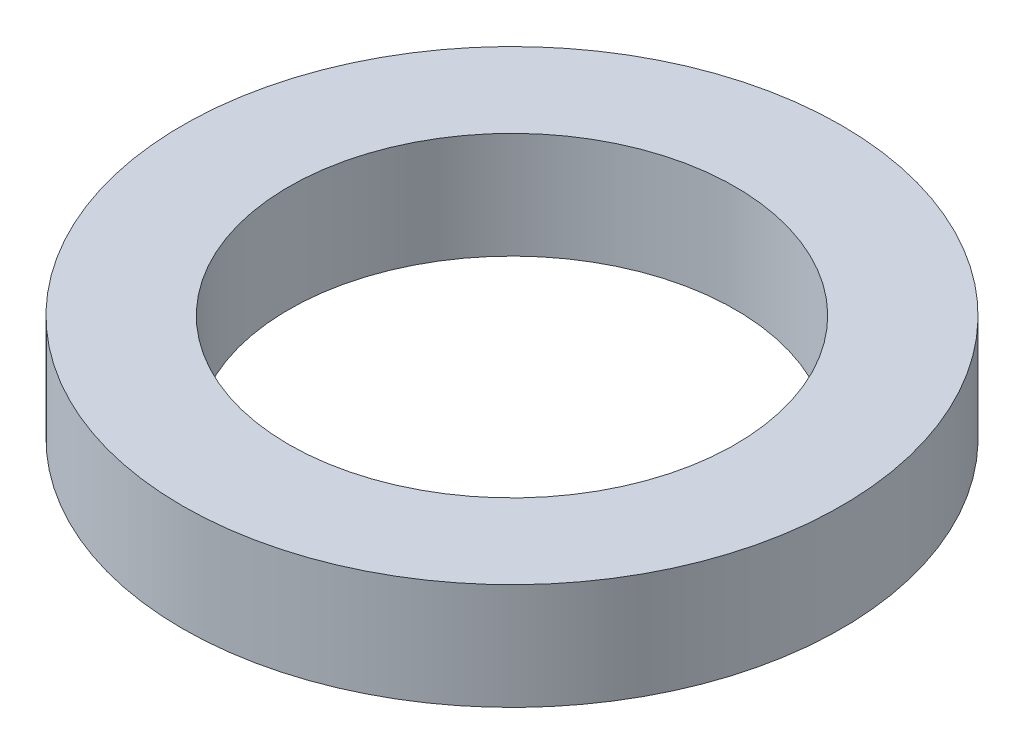
ISO-10303-21;
HEADER;
FILE_DESCRIPTION(('STEP AP214'),'2;1');
FILE_NAME('part.step','',(''),(''),'','','');
FILE_SCHEMA(('AUTOMOTIVE_DESIGN { 1 0 10303 214 1 1 1 1 }'));
ENDSEC;
DATA;
#1=APPLICATION_CONTEXT('core data for automotive mechanical design processes');
#2=APPLICATION_PROTOCOL_DEFINITION('international standard','automotive_design',2000,#1);
#3=PRODUCT_CONTEXT('',#1,'mechanical');
#4=PRODUCT('Part','Part','',(#3));
#5=PRODUCT_RELATED_PRODUCT_CATEGORY('part','',(#4));
#6=PRODUCT_DEFINITION_FORMATION('','',#4);
#7=PRODUCT_DEFINITION_CONTEXT('part definition',#1,'design');
#8=PRODUCT_DEFINITION('design','',#6,#7);
#9=PRODUCT_DEFINITION_SHAPE('','',#8);
#10=(LENGTH_UNIT() NAMED_UNIT(*) SI_UNIT(.MILLI.,.METRE.));
#11=(NAMED_UNIT(*) PLANE_ANGLE_UNIT() SI_UNIT($,.RADIAN.));
#12=(NAMED_UNIT(*) SI_UNIT($,.STERADIAN.) SOLID_ANGLE_UNIT());
#13=UNCERTAINTY_MEASURE_WITH_UNIT(LENGTH_MEASURE(1.E-05),#10,'distance_accuracy_value','');
#14=(GEOMETRIC_REPRESENTATION_CONTEXT(3) GLOBAL_UNCERTAINTY_ASSIGNED_CONTEXT((#13)) GLOBAL_UNIT_ASSIGNED_CONTEXT((#10,
#11,#12)) REPRESENTATION_CONTEXT('',''));
#15=CARTESIAN_POINT('',(0.,0.,0.));
#16=DIRECTION('',(0.,0.,1.));
#17=DIRECTION('',(1.,0.,0.));
#18=AXIS2_PLACEMENT_3D('',#15,#16,#17);
#19=CARTESIAN_POINT('',(0.,1.,0.));
#20=DIRECTION('',(0.,1.,0.));
#21=DIRECTION('',(0.,0.,1.));
#22=AXIS2_PLACEMENT_3D('',#19,#20,#21);
#23=PLANE('',#22);
#24=CARTESIAN_POINT('',(0.,1.,0.));
#25=DIRECTION('',(0.,1.,0.));
#26=DIRECTION('',(0.,0.,1.));
#27=AXIS2_PLACEMENT_3D('',#24,#25,#26);
#28=CIRCLE('',#27,3.1);
#29=CARTESIAN_POINT('',(0.,1.,3.1));
#30=VERTEX_POINT('',#29);
#31=EDGE_CURVE('E10',#30,#30,#28,.T.);
#32=ORIENTED_EDGE('',*,*,#31,.T.);
#33=EDGE_LOOP('',(#32));
#34=FACE_BOUND('',#33,.T.);
#35=CARTESIAN_POINT('',(0.,1.,0.));
#36=DIRECTION('',(0.,1.,0.));
#37=DIRECTION('',(0.,0.,1.));
#38=AXIS2_PLACEMENT_3D('',#35,#36,#37);
#39=CIRCLE('',#38,2.1);
#40=CARTESIAN_POINT('',(0.,1.,2.1));
#41=VERTEX_POINT('',#40);
#42=EDGE_CURVE('E50',#41,#41,#39,.T.);
#43=ORIENTED_EDGE('',*,*,#42,.F.);
#44=EDGE_LOOP('',(#43));
#45=FACE_BOUND('',#44,.T.);
#46=ADVANCED_FACE('F37',(#34,#45),#23,.T.);
#47=CARTESIAN_POINT('',(0.,0.,0.));
#48=DIRECTION('',(0.,1.,0.));
#49=DIRECTION('',(0.,0.,1.));
#50=AXIS2_PLACEMENT_3D('',#47,#48,#49);
#51=PLANE('',#50);
#52=CARTESIAN_POINT('',(0.,0.,0.));
#53=DIRECTION('',(0.,1.,0.));
#54=DIRECTION('',(0.,0.,1.));
#55=AXIS2_PLACEMENT_3D('',#52,#53,#54);
#56=CIRCLE('',#55,3.1);
#57=CARTESIAN_POINT('',(0.,0.,3.1));
#58=VERTEX_POINT('',#57);
#59=EDGE_CURVE('E41',#58,#58,#56,.T.);
#60=ORIENTED_EDGE('',*,*,#59,.F.);
#61=EDGE_LOOP('',(#60));
#62=FACE_BOUND('',#61,.T.);
#63=CARTESIAN_POINT('',(0.,0.,0.));
#64=DIRECTION('',(0.,1.,0.));
#65=DIRECTION('',(0.,0.,1.));
#66=AXIS2_PLACEMENT_3D('',#63,#64,#65);
#67=CIRCLE('',#66,2.1);
#68=CARTESIAN_POINT('',(0.,0.,2.1));
#69=VERTEX_POINT('',#68);
#70=EDGE_CURVE('E52',#69,#69,#67,.T.);
#71=ORIENTED_EDGE('',*,*,#70,.T.);
#72=EDGE_LOOP('',(#71));
#73=FACE_BOUND('',#72,.T.);
#74=ADVANCED_FACE('F64',(#62,#73),#51,.F.);
#75=CARTESIAN_POINT('',(0.,1.,0.));
#76=DIRECTION('',(0.,-1.,0.));
#77=DIRECTION('',(0.,0.,-1.));
#78=AXIS2_PLACEMENT_3D('',#75,#76,#77);
#79=CYLINDRICAL_SURFACE('',#78,3.1);
#80=ORIENTED_EDGE('',*,*,#31,.F.);
#81=EDGE_LOOP('',(#80));
#82=FACE_BOUND('',#81,.T.);
#83=ORIENTED_EDGE('',*,*,#59,.T.);
#84=EDGE_LOOP('',(#83));
#85=FACE_BOUND('',#84,.T.);
#86=ADVANCED_FACE('F39',(#82,#85),#79,.T.);
#87=CARTESIAN_POINT('',(0.,1.,0.));
#88=DIRECTION('',(0.,-1.,0.));
#89=DIRECTION('',(0.,0.,-1.));
#90=AXIS2_PLACEMENT_3D('',#87,#88,#89);
#91=CYLINDRICAL_SURFACE('',#90,2.1);
#92=ORIENTED_EDGE('',*,*,#42,.T.);
#93=EDGE_LOOP('',(#92));
#94=FACE_BOUND('',#93,.T.);
#95=ORIENTED_EDGE('',*,*,#70,.F.);
#96=EDGE_LOOP('',(#95));
#97=FACE_BOUND('',#96,.T.);
#98=ADVANCED_FACE('F60',(#94,#97),#91,.F.);
#99=CLOSED_SHELL('',(#46,#74,#86,#98));
#100=MANIFOLD_SOLID_BREP('B2',#99);
#101=ADVANCED_BREP_SHAPE_REPRESENTATION('',(#18,#100),#14);
#102=SHAPE_DEFINITION_REPRESENTATION(#9,#101);
ENDSEC;
END-ISO-10303-21;
